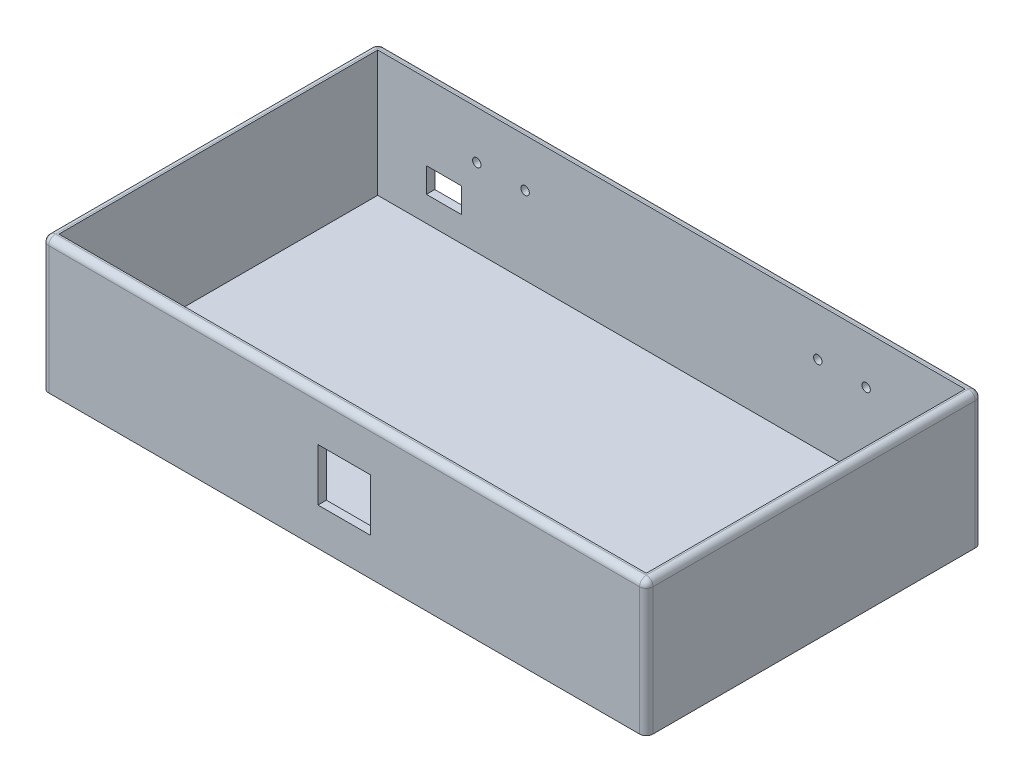
ISO-10303-21;
HEADER;
FILE_DESCRIPTION(('STEP AP214'),'2;1');
FILE_NAME('part.step','',(''),(''),'','','');
FILE_SCHEMA(('AUTOMOTIVE_DESIGN { 1 0 10303 214 1 1 1 1 }'));
ENDSEC;
DATA;
#1=APPLICATION_CONTEXT('core data for automotive mechanical design processes');
#2=APPLICATION_PROTOCOL_DEFINITION('international standard','automotive_design',2000,#1);
#3=PRODUCT_CONTEXT('',#1,'mechanical');
#4=PRODUCT('Part','Part','',(#3));
#5=PRODUCT_RELATED_PRODUCT_CATEGORY('part','',(#4));
#6=PRODUCT_DEFINITION_FORMATION('','',#4);
#7=PRODUCT_DEFINITION_CONTEXT('part definition',#1,'design');
#8=PRODUCT_DEFINITION('design','',#6,#7);
#9=PRODUCT_DEFINITION_SHAPE('','',#8);
#10=(LENGTH_UNIT() NAMED_UNIT(*) SI_UNIT(.MILLI.,.METRE.));
#11=(NAMED_UNIT(*) PLANE_ANGLE_UNIT() SI_UNIT($,.RADIAN.));
#12=(NAMED_UNIT(*) SI_UNIT($,.STERADIAN.) SOLID_ANGLE_UNIT());
#13=UNCERTAINTY_MEASURE_WITH_UNIT(LENGTH_MEASURE(1.E-05),#10,'distance_accuracy_value','');
#14=(GEOMETRIC_REPRESENTATION_CONTEXT(3) GLOBAL_UNCERTAINTY_ASSIGNED_CONTEXT((#13)) GLOBAL_UNIT_ASSIGNED_CONTEXT((#10,
#11,#12)) REPRESENTATION_CONTEXT('',''));
#15=CARTESIAN_POINT('',(0.,0.,0.));
#16=DIRECTION('',(0.,0.,1.));
#17=DIRECTION('',(1.,0.,0.));
#18=AXIS2_PLACEMENT_3D('',#15,#16,#17);
#19=CARTESIAN_POINT('',(228.6,101.6,-127.));
#20=DIRECTION('',(0.,0.,1.));
#21=DIRECTION('',(1.,0.,0.));
#22=AXIS2_PLACEMENT_3D('',#19,#20,#21);
#23=PLANE('',#22);
#24=DIRECTION('',(1.,0.,0.));
#25=VECTOR('',#24,1.);
#26=CARTESIAN_POINT('',(-185.42,44.196,-127.));
#27=LINE('',#26,#25);
#28=CARTESIAN_POINT('',(-185.42,44.196,-127.));
#29=VERTEX_POINT('',#28);
#30=CARTESIAN_POINT('',(-158.75,44.196,-127.));
#31=VERTEX_POINT('',#30);
#32=EDGE_CURVE('E206',#29,#31,#27,.T.);
#33=ORIENTED_EDGE('',*,*,#32,.F.);
#34=DIRECTION('',(0.,1.,0.));
#35=VECTOR('',#34,1.);
#36=CARTESIAN_POINT('',(-185.42,25.4,-127.));
#37=LINE('',#36,#35);
#38=CARTESIAN_POINT('',(-185.42,25.4,-127.));
#39=VERTEX_POINT('',#38);
#40=EDGE_CURVE('E54',#39,#29,#37,.T.);
#41=ORIENTED_EDGE('',*,*,#40,.F.);
#42=DIRECTION('',(1.,0.,0.));
#43=VECTOR('',#42,1.);
#44=CARTESIAN_POINT('',(-185.42,25.4,-127.));
#45=LINE('',#44,#43);
#46=CARTESIAN_POINT('',(-158.75,25.4,-127.));
#47=VERTEX_POINT('',#46);
#48=EDGE_CURVE('E193',#39,#47,#45,.T.);
#49=ORIENTED_EDGE('',*,*,#48,.T.);
#50=DIRECTION('',(0.,1.,0.));
#51=VECTOR('',#50,1.);
#52=CARTESIAN_POINT('',(-158.75,25.4,-127.));
#53=LINE('',#52,#51);
#54=EDGE_CURVE('E219',#47,#31,#53,.T.);
#55=ORIENTED_EDGE('',*,*,#54,.T.);
#56=EDGE_LOOP('',(#33,#41,#49,#55));
#57=FACE_BOUND('',#56,.T.);
#58=CARTESIAN_POINT('',(-110.744,65.278,-127.));
#59=DIRECTION('',(0.,0.,-1.));
#60=DIRECTION('',(-1.,0.,0.));
#61=AXIS2_PLACEMENT_3D('',#58,#59,#60);
#62=CIRCLE('',#61,3.17499999999998);
#63=CARTESIAN_POINT('',(-113.919,65.278,-127.));
#64=VERTEX_POINT('',#63);
#65=EDGE_CURVE('E232',#64,#64,#62,.T.);
#66=ORIENTED_EDGE('',*,*,#65,.F.);
#67=EDGE_LOOP('',(#66));
#68=FACE_BOUND('',#67,.T.);
#69=CARTESIAN_POINT('',(110.744,65.278,-127.));
#70=DIRECTION('',(0.,0.,1.));
#71=DIRECTION('',(1.,0.,0.));
#72=AXIS2_PLACEMENT_3D('',#69,#70,#71);
#73=CIRCLE('',#72,3.17499999999998);
#74=CARTESIAN_POINT('',(113.919,65.278,-127.));
#75=VERTEX_POINT('',#74);
#76=EDGE_CURVE('E236',#75,#75,#73,.T.);
#77=ORIENTED_EDGE('',*,*,#76,.T.);
#78=EDGE_LOOP('',(#77));
#79=FACE_BOUND('',#78,.T.);
#80=CARTESIAN_POINT('',(147.32,65.278,-127.));
#81=DIRECTION('',(0.,0.,1.));
#82=DIRECTION('',(1.,0.,0.));
#83=AXIS2_PLACEMENT_3D('',#80,#81,#82);
#84=CIRCLE('',#83,3.17499999999997);
#85=CARTESIAN_POINT('',(150.495,65.278,-127.));
#86=VERTEX_POINT('',#85);
#87=EDGE_CURVE('E217',#86,#86,#84,.T.);
#88=ORIENTED_EDGE('',*,*,#87,.T.);
#89=EDGE_LOOP('',(#88));
#90=FACE_BOUND('',#89,.T.);
#91=DIRECTION('',(-1.,0.,0.));
#92=VECTOR('',#91,1.);
#93=CARTESIAN_POINT('',(228.6,96.52,-127.));
#94=LINE('',#93,#92);
#95=CARTESIAN_POINT('',(-223.52,96.52,-127.));
#96=VERTEX_POINT('',#95);
#97=CARTESIAN_POINT('',(223.52,96.52,-127.));
#98=VERTEX_POINT('',#97);
#99=EDGE_CURVE('E338',#96,#98,#94,.F.);
#100=ORIENTED_EDGE('',*,*,#99,.T.);
#101=DIRECTION('',(0.,-1.,0.));
#102=VECTOR('',#101,1.);
#103=CARTESIAN_POINT('',(223.52,101.6,-127.));
#104=LINE('',#103,#102);
#105=CARTESIAN_POINT('',(223.52,0.,-127.));
#106=VERTEX_POINT('',#105);
#107=EDGE_CURVE('E340',#98,#106,#104,.T.);
#108=ORIENTED_EDGE('',*,*,#107,.T.);
#109=DIRECTION('',(-1.,0.,0.));
#110=VECTOR('',#109,1.);
#111=CARTESIAN_POINT('',(228.6,0.,-127.));
#112=LINE('',#111,#110);
#113=CARTESIAN_POINT('',(-223.52,0.,-127.));
#114=VERTEX_POINT('',#113);
#115=EDGE_CURVE('E317',#106,#114,#112,.T.);
#116=ORIENTED_EDGE('',*,*,#115,.T.);
#117=DIRECTION('',(0.,-1.,0.));
#118=VECTOR('',#117,1.);
#119=CARTESIAN_POINT('',(-223.52,101.6,-127.));
#120=LINE('',#119,#118);
#121=EDGE_CURVE('E336',#114,#96,#120,.F.);
#122=ORIENTED_EDGE('',*,*,#121,.T.);
#123=EDGE_LOOP('',(#100,#108,#116,#122));
#124=FACE_BOUND('',#123,.T.);
#125=CARTESIAN_POINT('',(-147.32,65.278,-127.));
#126=DIRECTION('',(0.,0.,-1.));
#127=DIRECTION('',(-1.,0.,0.));
#128=AXIS2_PLACEMENT_3D('',#125,#126,#127);
#129=CIRCLE('',#128,3.17499999999997);
#130=CARTESIAN_POINT('',(-150.495,65.278,-127.));
#131=VERTEX_POINT('',#130);
#132=EDGE_CURVE('E222',#131,#131,#129,.T.);
#133=ORIENTED_EDGE('',*,*,#132,.F.);
#134=EDGE_LOOP('',(#133));
#135=FACE_BOUND('',#134,.T.);
#136=ADVANCED_FACE('F37',(#57,#68,#79,#90,#124,#135),#23,.F.);
#137=CARTESIAN_POINT('',(228.6,101.6,-120.65));
#138=DIRECTION('',(0.,0.,1.));
#139=DIRECTION('',(1.,0.,0.));
#140=AXIS2_PLACEMENT_3D('',#137,#138,#139);
#141=PLANE('',#140);
#142=DIRECTION('',(0.,1.,0.));
#143=VECTOR('',#142,1.);
#144=CARTESIAN_POINT('',(-185.42,25.4,-120.65));
#145=LINE('',#144,#143);
#146=CARTESIAN_POINT('',(-185.42,25.4,-120.65));
#147=VERTEX_POINT('',#146);
#148=CARTESIAN_POINT('',(-185.42,44.196,-120.65));
#149=VERTEX_POINT('',#148);
#150=EDGE_CURVE('E190',#147,#149,#145,.T.);
#151=ORIENTED_EDGE('',*,*,#150,.T.);
#152=DIRECTION('',(1.,0.,0.));
#153=VECTOR('',#152,1.);
#154=CARTESIAN_POINT('',(-185.42,44.196,-120.65));
#155=LINE('',#154,#153);
#156=CARTESIAN_POINT('',(-158.75,44.196,-120.65));
#157=VERTEX_POINT('',#156);
#158=EDGE_CURVE('E210',#149,#157,#155,.T.);
#159=ORIENTED_EDGE('',*,*,#158,.T.);
#160=DIRECTION('',(0.,1.,0.));
#161=VECTOR('',#160,1.);
#162=CARTESIAN_POINT('',(-158.75,25.4,-120.65));
#163=LINE('',#162,#161);
#164=CARTESIAN_POINT('',(-158.75,25.4,-120.65));
#165=VERTEX_POINT('',#164);
#166=EDGE_CURVE('E216',#165,#157,#163,.T.);
#167=ORIENTED_EDGE('',*,*,#166,.F.);
#168=DIRECTION('',(1.,0.,0.));
#169=VECTOR('',#168,1.);
#170=CARTESIAN_POINT('',(-185.42,25.4,-120.65));
#171=LINE('',#170,#169);
#172=EDGE_CURVE('E208',#147,#165,#171,.T.);
#173=ORIENTED_EDGE('',*,*,#172,.F.);
#174=EDGE_LOOP('',(#151,#159,#167,#173));
#175=FACE_BOUND('',#174,.T.);
#176=CARTESIAN_POINT('',(110.744,65.278,-120.65));
#177=DIRECTION('',(0.,0.,1.));
#178=DIRECTION('',(1.,0.,0.));
#179=AXIS2_PLACEMENT_3D('',#176,#177,#178);
#180=CIRCLE('',#179,3.17499999999998);
#181=CARTESIAN_POINT('',(113.919,65.278,-120.65));
#182=VERTEX_POINT('',#181);
#183=EDGE_CURVE('E235',#182,#182,#180,.T.);
#184=ORIENTED_EDGE('',*,*,#183,.F.);
#185=EDGE_LOOP('',(#184));
#186=FACE_BOUND('',#185,.T.);
#187=CARTESIAN_POINT('',(147.32,65.278,-120.65));
#188=DIRECTION('',(0.,0.,1.));
#189=DIRECTION('',(1.,0.,0.));
#190=AXIS2_PLACEMENT_3D('',#187,#188,#189);
#191=CIRCLE('',#190,3.17499999999997);
#192=CARTESIAN_POINT('',(150.495,65.278,-120.65));
#193=VERTEX_POINT('',#192);
#194=EDGE_CURVE('E239',#193,#193,#191,.T.);
#195=ORIENTED_EDGE('',*,*,#194,.F.);
#196=EDGE_LOOP('',(#195));
#197=FACE_BOUND('',#196,.T.);
#198=DIRECTION('',(-1.,0.,0.));
#199=VECTOR('',#198,1.);
#200=CARTESIAN_POINT('',(228.6,6.34999999999999,-120.65));
#201=LINE('',#200,#199);
#202=CARTESIAN_POINT('',(222.25,6.35,-120.65));
#203=VERTEX_POINT('',#202);
#204=CARTESIAN_POINT('',(-222.25,6.35,-120.65));
#205=VERTEX_POINT('',#204);
#206=EDGE_CURVE('E297',#203,#205,#201,.T.);
#207=ORIENTED_EDGE('',*,*,#206,.F.);
#208=DIRECTION('',(0.,-1.,0.));
#209=VECTOR('',#208,1.);
#210=CARTESIAN_POINT('',(222.25,101.6,-120.65));
#211=LINE('',#210,#209);
#212=CARTESIAN_POINT('',(222.25,101.6,-120.65));
#213=VERTEX_POINT('',#212);
#214=EDGE_CURVE('E290',#213,#203,#211,.T.);
#215=ORIENTED_EDGE('',*,*,#214,.F.);
#216=DIRECTION('',(-1.,0.,0.));
#217=VECTOR('',#216,1.);
#218=CARTESIAN_POINT('',(228.6,101.6,-120.65));
#219=LINE('',#218,#217);
#220=CARTESIAN_POINT('',(-222.25,101.6,-120.65));
#221=VERTEX_POINT('',#220);
#222=EDGE_CURVE('E291',#213,#221,#219,.T.);
#223=ORIENTED_EDGE('',*,*,#222,.T.);
#224=DIRECTION('',(0.,-1.,0.));
#225=VECTOR('',#224,1.);
#226=CARTESIAN_POINT('',(-222.25,101.6,-120.65));
#227=LINE('',#226,#225);
#228=EDGE_CURVE('E287',#221,#205,#227,.T.);
#229=ORIENTED_EDGE('',*,*,#228,.T.);
#230=EDGE_LOOP('',(#207,#215,#223,#229));
#231=FACE_BOUND('',#230,.T.);
#232=CARTESIAN_POINT('',(-110.744,65.278,-120.65));
#233=DIRECTION('',(0.,0.,1.));
#234=DIRECTION('',(1.,0.,0.));
#235=AXIS2_PLACEMENT_3D('',#232,#233,#234);
#236=CIRCLE('',#235,3.17499999999998);
#237=CARTESIAN_POINT('',(-107.569,65.278,-120.65));
#238=VERTEX_POINT('',#237);
#239=EDGE_CURVE('E229',#238,#238,#236,.F.);
#240=ORIENTED_EDGE('',*,*,#239,.T.);
#241=EDGE_LOOP('',(#240));
#242=FACE_BOUND('',#241,.T.);
#243=CARTESIAN_POINT('',(-147.32,65.278,-120.65));
#244=DIRECTION('',(0.,0.,1.));
#245=DIRECTION('',(1.,0.,0.));
#246=AXIS2_PLACEMENT_3D('',#243,#244,#245);
#247=CIRCLE('',#246,3.17499999999997);
#248=CARTESIAN_POINT('',(-144.145,65.278,-120.65));
#249=VERTEX_POINT('',#248);
#250=EDGE_CURVE('E226',#249,#249,#247,.F.);
#251=ORIENTED_EDGE('',*,*,#250,.T.);
#252=EDGE_LOOP('',(#251));
#253=FACE_BOUND('',#252,.T.);
#254=ADVANCED_FACE('F466',(#175,#186,#197,#231,#242,#253),#141,.T.);
#255=CARTESIAN_POINT('',(-228.6,101.6,127.));
#256=DIRECTION('',(1.,0.,0.));
#257=DIRECTION('',(0.,0.,-1.));
#258=AXIS2_PLACEMENT_3D('',#255,#256,#257);
#259=PLANE('',#258);
#260=DIRECTION('',(0.,0.,1.));
#261=VECTOR('',#260,1.);
#262=CARTESIAN_POINT('',(-228.6,96.52,-127.));
#263=LINE('',#262,#261);
#264=CARTESIAN_POINT('',(-228.6,96.52,121.92));
#265=VERTEX_POINT('',#264);
#266=CARTESIAN_POINT('',(-228.6,96.52,-121.92));
#267=VERTEX_POINT('',#266);
#268=EDGE_CURVE('E344',#265,#267,#263,.F.);
#269=ORIENTED_EDGE('',*,*,#268,.T.);
#270=DIRECTION('',(0.,-1.,0.));
#271=VECTOR('',#270,1.);
#272=CARTESIAN_POINT('',(-228.6,101.6,-121.92));
#273=LINE('',#272,#271);
#274=CARTESIAN_POINT('',(-228.6,0.,-121.92));
#275=VERTEX_POINT('',#274);
#276=EDGE_CURVE('E346',#267,#275,#273,.T.);
#277=ORIENTED_EDGE('',*,*,#276,.T.);
#278=DIRECTION('',(0.,0.,1.));
#279=VECTOR('',#278,1.);
#280=CARTESIAN_POINT('',(-228.6,0.,127.));
#281=LINE('',#280,#279);
#282=CARTESIAN_POINT('',(-228.6,0.,121.92));
#283=VERTEX_POINT('',#282);
#284=EDGE_CURVE('E285',#275,#283,#281,.T.);
#285=ORIENTED_EDGE('',*,*,#284,.T.);
#286=DIRECTION('',(0.,-1.,0.));
#287=VECTOR('',#286,1.);
#288=CARTESIAN_POINT('',(-228.6,101.6,121.92));
#289=LINE('',#288,#287);
#290=EDGE_CURVE('E342',#283,#265,#289,.F.);
#291=ORIENTED_EDGE('',*,*,#290,.T.);
#292=EDGE_LOOP('',(#269,#277,#285,#291));
#293=FACE_BOUND('',#292,.T.);
#294=ADVANCED_FACE('F415',(#293),#259,.F.);
#295=CARTESIAN_POINT('',(228.6,101.6,127.));
#296=DIRECTION('',(0.,0.,-1.));
#297=DIRECTION('',(-1.,0.,0.));
#298=AXIS2_PLACEMENT_3D('',#295,#296,#297);
#299=PLANE('',#298);
#300=DIRECTION('',(-1.,0.,0.));
#301=VECTOR('',#300,1.);
#302=CARTESIAN_POINT('',(-19.812,68.072,127.));
#303=LINE('',#302,#301);
#304=CARTESIAN_POINT('',(19.812,68.072,127.));
#305=VERTEX_POINT('',#304);
#306=CARTESIAN_POINT('',(-19.812,68.072,127.));
#307=VERTEX_POINT('',#306);
#308=EDGE_CURVE('E258',#305,#307,#303,.T.);
#309=ORIENTED_EDGE('',*,*,#308,.F.);
#310=DIRECTION('',(0.,1.,0.));
#311=VECTOR('',#310,1.);
#312=CARTESIAN_POINT('',(19.812,28.448,127.));
#313=LINE('',#312,#311);
#314=CARTESIAN_POINT('',(19.812,28.448,127.));
#315=VERTEX_POINT('',#314);
#316=EDGE_CURVE('E261',#315,#305,#313,.T.);
#317=ORIENTED_EDGE('',*,*,#316,.F.);
#318=DIRECTION('',(1.,0.,0.));
#319=VECTOR('',#318,1.);
#320=CARTESIAN_POINT('',(-19.812,28.448,127.));
#321=LINE('',#320,#319);
#322=CARTESIAN_POINT('',(-19.812,28.448,127.));
#323=VERTEX_POINT('',#322);
#324=EDGE_CURVE('E251',#323,#315,#321,.T.);
#325=ORIENTED_EDGE('',*,*,#324,.F.);
#326=DIRECTION('',(0.,-1.,0.));
#327=VECTOR('',#326,1.);
#328=CARTESIAN_POINT('',(-19.812,28.448,127.));
#329=LINE('',#328,#327);
#330=EDGE_CURVE('E255',#307,#323,#329,.T.);
#331=ORIENTED_EDGE('',*,*,#330,.F.);
#332=EDGE_LOOP('',(#309,#317,#325,#331));
#333=FACE_BOUND('',#332,.T.);
#334=DIRECTION('',(1.,0.,0.));
#335=VECTOR('',#334,1.);
#336=CARTESIAN_POINT('',(228.6,0.,127.));
#337=LINE('',#336,#335);
#338=CARTESIAN_POINT('',(-223.52,0.,127.));
#339=VERTEX_POINT('',#338);
#340=CARTESIAN_POINT('',(223.52,0.,127.));
#341=VERTEX_POINT('',#340);
#342=EDGE_CURVE('E311',#339,#341,#337,.T.);
#343=ORIENTED_EDGE('',*,*,#342,.T.);
#344=DIRECTION('',(0.,-1.,0.));
#345=VECTOR('',#344,1.);
#346=CARTESIAN_POINT('',(223.52,101.6,127.));
#347=LINE('',#346,#345);
#348=CARTESIAN_POINT('',(223.52,96.52,127.));
#349=VERTEX_POINT('',#348);
#350=EDGE_CURVE('E352',#341,#349,#347,.F.);
#351=ORIENTED_EDGE('',*,*,#350,.T.);
#352=DIRECTION('',(1.,0.,0.));
#353=VECTOR('',#352,1.);
#354=CARTESIAN_POINT('',(-228.6,96.52,127.));
#355=LINE('',#354,#353);
#356=CARTESIAN_POINT('',(-223.52,96.52,127.));
#357=VERTEX_POINT('',#356);
#358=EDGE_CURVE('E350',#349,#357,#355,.F.);
#359=ORIENTED_EDGE('',*,*,#358,.T.);
#360=DIRECTION('',(0.,-1.,0.));
#361=VECTOR('',#360,1.);
#362=CARTESIAN_POINT('',(-223.52,101.6,127.));
#363=LINE('',#362,#361);
#364=EDGE_CURVE('E348',#357,#339,#363,.T.);
#365=ORIENTED_EDGE('',*,*,#364,.T.);
#366=EDGE_LOOP('',(#343,#351,#359,#365));
#367=FACE_BOUND('',#366,.T.);
#368=ADVANCED_FACE('F454',(#333,#367),#299,.F.);
#369=CARTESIAN_POINT('',(228.6,101.6,127.));
#370=DIRECTION('',(-1.,0.,0.));
#371=DIRECTION('',(0.,0.,1.));
#372=AXIS2_PLACEMENT_3D('',#369,#370,#371);
#373=PLANE('',#372);
#374=DIRECTION('',(0.,0.,-1.));
#375=VECTOR('',#374,1.);
#376=CARTESIAN_POINT('',(228.6,0.,127.));
#377=LINE('',#376,#375);
#378=CARTESIAN_POINT('',(228.6,0.,121.92));
#379=VERTEX_POINT('',#378);
#380=CARTESIAN_POINT('',(228.6,0.,-121.92));
#381=VERTEX_POINT('',#380);
#382=EDGE_CURVE('E314',#379,#381,#377,.T.);
#383=ORIENTED_EDGE('',*,*,#382,.T.);
#384=DIRECTION('',(0.,-1.,0.));
#385=VECTOR('',#384,1.);
#386=CARTESIAN_POINT('',(228.6,101.6,-121.92));
#387=LINE('',#386,#385);
#388=CARTESIAN_POINT('',(228.6,96.52,-121.92));
#389=VERTEX_POINT('',#388);
#390=EDGE_CURVE('E334',#381,#389,#387,.F.);
#391=ORIENTED_EDGE('',*,*,#390,.T.);
#392=DIRECTION('',(0.,0.,-1.));
#393=VECTOR('',#392,1.);
#394=CARTESIAN_POINT('',(228.6,96.52,127.));
#395=LINE('',#394,#393);
#396=CARTESIAN_POINT('',(228.6,96.52,121.92));
#397=VERTEX_POINT('',#396);
#398=EDGE_CURVE('E331',#389,#397,#395,.F.);
#399=ORIENTED_EDGE('',*,*,#398,.T.);
#400=DIRECTION('',(0.,-1.,0.));
#401=VECTOR('',#400,1.);
#402=CARTESIAN_POINT('',(228.6,101.6,121.92));
#403=LINE('',#402,#401);
#404=EDGE_CURVE('E329',#397,#379,#403,.T.);
#405=ORIENTED_EDGE('',*,*,#404,.T.);
#406=EDGE_LOOP('',(#383,#391,#399,#405));
#407=FACE_BOUND('',#406,.T.);
#408=ADVANCED_FACE('F445',(#407),#373,.F.);
#409=CARTESIAN_POINT('',(0.,101.6,0.));
#410=DIRECTION('',(0.,1.,0.));
#411=DIRECTION('',(0.,0.,1.));
#412=AXIS2_PLACEMENT_3D('',#409,#410,#411);
#413=PLANE('',#412);
#414=DIRECTION('',(1.,0.,0.));
#415=VECTOR('',#414,1.);
#416=CARTESIAN_POINT('',(228.6,101.6,121.92));
#417=LINE('',#416,#415);
#418=CARTESIAN_POINT('',(-223.52,101.6,121.92));
#419=VERTEX_POINT('',#418);
#420=CARTESIAN_POINT('',(223.52,101.6,121.92));
#421=VERTEX_POINT('',#420);
#422=EDGE_CURVE('E320',#419,#421,#417,.T.);
#423=ORIENTED_EDGE('',*,*,#422,.T.);
#424=DIRECTION('',(0.,0.,-1.));
#425=VECTOR('',#424,1.);
#426=CARTESIAN_POINT('',(223.52,101.6,-127.));
#427=LINE('',#426,#425);
#428=CARTESIAN_POINT('',(223.52,101.6,-121.92));
#429=VERTEX_POINT('',#428);
#430=EDGE_CURVE('E326',#421,#429,#427,.T.);
#431=ORIENTED_EDGE('',*,*,#430,.T.);
#432=DIRECTION('',(-1.,0.,0.));
#433=VECTOR('',#432,1.);
#434=CARTESIAN_POINT('',(-228.6,101.6,-121.92));
#435=LINE('',#434,#433);
#436=CARTESIAN_POINT('',(-223.52,101.6,-121.92));
#437=VERTEX_POINT('',#436);
#438=EDGE_CURVE('E324',#429,#437,#435,.T.);
#439=ORIENTED_EDGE('',*,*,#438,.T.);
#440=DIRECTION('',(0.,0.,1.));
#441=VECTOR('',#440,1.);
#442=CARTESIAN_POINT('',(-223.52,101.6,127.));
#443=LINE('',#442,#441);
#444=EDGE_CURVE('E322',#437,#419,#443,.T.);
#445=ORIENTED_EDGE('',*,*,#444,.T.);
#446=EDGE_LOOP('',(#423,#431,#439,#445));
#447=FACE_BOUND('',#446,.T.);
#448=DIRECTION('',(0.,0.,1.));
#449=VECTOR('',#448,1.);
#450=CARTESIAN_POINT('',(-222.25,101.6,127.));
#451=LINE('',#450,#449);
#452=CARTESIAN_POINT('',(-222.25,101.6,120.65));
#453=VERTEX_POINT('',#452);
#454=EDGE_CURVE('E301',#221,#453,#451,.T.);
#455=ORIENTED_EDGE('',*,*,#454,.F.);
#456=ORIENTED_EDGE('',*,*,#222,.F.);
#457=DIRECTION('',(0.,0.,-1.));
#458=VECTOR('',#457,1.);
#459=CARTESIAN_POINT('',(222.25,101.6,127.));
#460=LINE('',#459,#458);
#461=CARTESIAN_POINT('',(222.25,101.6,120.65));
#462=VERTEX_POINT('',#461);
#463=EDGE_CURVE('E305',#462,#213,#460,.T.);
#464=ORIENTED_EDGE('',*,*,#463,.F.);
#465=DIRECTION('',(1.,0.,0.));
#466=VECTOR('',#465,1.);
#467=CARTESIAN_POINT('',(228.6,101.6,120.65));
#468=LINE('',#467,#466);
#469=EDGE_CURVE('E303',#453,#462,#468,.T.);
#470=ORIENTED_EDGE('',*,*,#469,.F.);
#471=EDGE_LOOP('',(#455,#456,#464,#470));
#472=FACE_BOUND('',#471,.T.);
#473=ADVANCED_FACE('F404',(#447,#472),#413,.T.);
#474=CARTESIAN_POINT('',(0.,0.,0.));
#475=DIRECTION('',(0.,1.,0.));
#476=DIRECTION('',(0.,0.,1.));
#477=AXIS2_PLACEMENT_3D('',#474,#475,#476);
#478=PLANE('',#477);
#479=ORIENTED_EDGE('',*,*,#115,.F.);
#480=CARTESIAN_POINT('',(223.52,0.,-121.92));
#481=DIRECTION('',(0.,1.,0.));
#482=DIRECTION('',(0.,0.,1.));
#483=AXIS2_PLACEMENT_3D('',#480,#481,#482);
#484=CIRCLE('',#483,5.08);
#485=EDGE_CURVE('E11',#106,#381,#484,.F.);
#486=ORIENTED_EDGE('',*,*,#485,.T.);
#487=ORIENTED_EDGE('',*,*,#382,.F.);
#488=CARTESIAN_POINT('',(223.52,0.,121.92));
#489=DIRECTION('',(0.,1.,0.));
#490=DIRECTION('',(0.,0.,1.));
#491=AXIS2_PLACEMENT_3D('',#488,#489,#490);
#492=CIRCLE('',#491,5.08);
#493=EDGE_CURVE('E46',#379,#341,#492,.F.);
#494=ORIENTED_EDGE('',*,*,#493,.T.);
#495=ORIENTED_EDGE('',*,*,#342,.F.);
#496=CARTESIAN_POINT('',(-223.52,0.,121.92));
#497=DIRECTION('',(0.,1.,0.));
#498=DIRECTION('',(0.,0.,1.));
#499=AXIS2_PLACEMENT_3D('',#496,#497,#498);
#500=CIRCLE('',#499,5.08);
#501=EDGE_CURVE('E354',#339,#283,#500,.F.);
#502=ORIENTED_EDGE('',*,*,#501,.T.);
#503=ORIENTED_EDGE('',*,*,#284,.F.);
#504=CARTESIAN_POINT('',(-223.52,0.,-121.92));
#505=DIRECTION('',(0.,1.,0.));
#506=DIRECTION('',(0.,0.,1.));
#507=AXIS2_PLACEMENT_3D('',#504,#505,#506);
#508=CIRCLE('',#507,5.08);
#509=EDGE_CURVE('E356',#275,#114,#508,.F.);
#510=ORIENTED_EDGE('',*,*,#509,.T.);
#511=EDGE_LOOP('',(#479,#486,#487,#494,#495,#502,#503,#510));
#512=FACE_BOUND('',#511,.T.);
#513=ADVANCED_FACE('F425',(#512),#478,.F.);
#514=CARTESIAN_POINT('',(-222.25,101.6,127.));
#515=DIRECTION('',(1.,0.,0.));
#516=DIRECTION('',(0.,0.,-1.));
#517=AXIS2_PLACEMENT_3D('',#514,#515,#516);
#518=PLANE('',#517);
#519=DIRECTION('',(0.,0.,1.));
#520=VECTOR('',#519,1.);
#521=CARTESIAN_POINT('',(-222.25,6.34999999999999,127.));
#522=LINE('',#521,#520);
#523=CARTESIAN_POINT('',(-222.25,6.35,120.65));
#524=VERTEX_POINT('',#523);
#525=EDGE_CURVE('E278',#205,#524,#522,.T.);
#526=ORIENTED_EDGE('',*,*,#525,.F.);
#527=ORIENTED_EDGE('',*,*,#228,.F.);
#528=ORIENTED_EDGE('',*,*,#454,.T.);
#529=DIRECTION('',(0.,-1.,0.));
#530=VECTOR('',#529,1.);
#531=CARTESIAN_POINT('',(-222.25,101.6,120.65));
#532=LINE('',#531,#530);
#533=EDGE_CURVE('E282',#453,#524,#532,.T.);
#534=ORIENTED_EDGE('',*,*,#533,.T.);
#535=EDGE_LOOP('',(#526,#527,#528,#534));
#536=FACE_BOUND('',#535,.T.);
#537=ADVANCED_FACE('F667',(#536),#518,.T.);
#538=CARTESIAN_POINT('',(228.6,101.6,120.65));
#539=DIRECTION('',(0.,0.,-1.));
#540=DIRECTION('',(-1.,0.,0.));
#541=AXIS2_PLACEMENT_3D('',#538,#539,#540);
#542=PLANE('',#541);
#543=DIRECTION('',(0.,1.,0.));
#544=VECTOR('',#543,1.);
#545=CARTESIAN_POINT('',(19.812,28.448,120.65));
#546=LINE('',#545,#544);
#547=CARTESIAN_POINT('',(19.812,28.448,120.65));
#548=VERTEX_POINT('',#547);
#549=CARTESIAN_POINT('',(19.812,68.072,120.65));
#550=VERTEX_POINT('',#549);
#551=EDGE_CURVE('E225',#548,#550,#546,.T.);
#552=ORIENTED_EDGE('',*,*,#551,.T.);
#553=DIRECTION('',(-1.,0.,0.));
#554=VECTOR('',#553,1.);
#555=CARTESIAN_POINT('',(-19.8119999999999,68.072,120.65));
#556=LINE('',#555,#554);
#557=CARTESIAN_POINT('',(-19.812,68.072,120.65));
#558=VERTEX_POINT('',#557);
#559=EDGE_CURVE('E246',#550,#558,#556,.T.);
#560=ORIENTED_EDGE('',*,*,#559,.T.);
#561=DIRECTION('',(0.,-1.,0.));
#562=VECTOR('',#561,1.);
#563=CARTESIAN_POINT('',(-19.812,28.448,120.65));
#564=LINE('',#563,#562);
#565=CARTESIAN_POINT('',(-19.812,28.448,120.65));
#566=VERTEX_POINT('',#565);
#567=EDGE_CURVE('E270',#558,#566,#564,.T.);
#568=ORIENTED_EDGE('',*,*,#567,.T.);
#569=DIRECTION('',(1.,0.,0.));
#570=VECTOR('',#569,1.);
#571=CARTESIAN_POINT('',(-19.8119999999999,28.448,120.65));
#572=LINE('',#571,#570);
#573=EDGE_CURVE('E266',#566,#548,#572,.T.);
#574=ORIENTED_EDGE('',*,*,#573,.T.);
#575=EDGE_LOOP('',(#552,#560,#568,#574));
#576=FACE_BOUND('',#575,.T.);
#577=DIRECTION('',(1.,0.,0.));
#578=VECTOR('',#577,1.);
#579=CARTESIAN_POINT('',(228.6,6.34999999999999,120.65));
#580=LINE('',#579,#578);
#581=CARTESIAN_POINT('',(222.25,6.35,120.65));
#582=VERTEX_POINT('',#581);
#583=EDGE_CURVE('E281',#524,#582,#580,.T.);
#584=ORIENTED_EDGE('',*,*,#583,.F.);
#585=ORIENTED_EDGE('',*,*,#533,.F.);
#586=ORIENTED_EDGE('',*,*,#469,.T.);
#587=DIRECTION('',(0.,-1.,0.));
#588=VECTOR('',#587,1.);
#589=CARTESIAN_POINT('',(222.25,101.6,120.65));
#590=LINE('',#589,#588);
#591=EDGE_CURVE('E286',#462,#582,#590,.T.);
#592=ORIENTED_EDGE('',*,*,#591,.T.);
#593=EDGE_LOOP('',(#584,#585,#586,#592));
#594=FACE_BOUND('',#593,.T.);
#595=ADVANCED_FACE('F670',(#576,#594),#542,.T.);
#596=CARTESIAN_POINT('',(222.25,101.6,127.));
#597=DIRECTION('',(-1.,0.,0.));
#598=DIRECTION('',(0.,0.,1.));
#599=AXIS2_PLACEMENT_3D('',#596,#597,#598);
#600=PLANE('',#599);
#601=DIRECTION('',(0.,0.,-1.));
#602=VECTOR('',#601,1.);
#603=CARTESIAN_POINT('',(222.25,6.34999999999999,127.));
#604=LINE('',#603,#602);
#605=EDGE_CURVE('E293',#582,#203,#604,.T.);
#606=ORIENTED_EDGE('',*,*,#605,.F.);
#607=ORIENTED_EDGE('',*,*,#591,.F.);
#608=ORIENTED_EDGE('',*,*,#463,.T.);
#609=ORIENTED_EDGE('',*,*,#214,.T.);
#610=EDGE_LOOP('',(#606,#607,#608,#609));
#611=FACE_BOUND('',#610,.T.);
#612=ADVANCED_FACE('F462',(#611),#600,.T.);
#613=CARTESIAN_POINT('',(0.,6.35,0.));
#614=DIRECTION('',(0.,1.,0.));
#615=DIRECTION('',(0.,0.,1.));
#616=AXIS2_PLACEMENT_3D('',#613,#614,#615);
#617=PLANE('',#616);
#618=ORIENTED_EDGE('',*,*,#525,.T.);
#619=ORIENTED_EDGE('',*,*,#583,.T.);
#620=ORIENTED_EDGE('',*,*,#605,.T.);
#621=ORIENTED_EDGE('',*,*,#206,.T.);
#622=EDGE_LOOP('',(#618,#619,#620,#621));
#623=FACE_BOUND('',#622,.T.);
#624=ADVANCED_FACE('F457',(#623),#617,.T.);
#625=CARTESIAN_POINT('',(-223.52,101.6,121.92));
#626=DIRECTION('',(0.,-1.,0.));
#627=DIRECTION('',(0.,0.,-1.));
#628=AXIS2_PLACEMENT_3D('',#625,#626,#627);
#629=CYLINDRICAL_SURFACE('',#628,5.08);
#630=ORIENTED_EDGE('',*,*,#501,.F.);
#631=ORIENTED_EDGE('',*,*,#364,.F.);
#632=CARTESIAN_POINT('',(-223.52,96.52,121.92));
#633=DIRECTION('',(0.,1.,0.));
#634=DIRECTION('',(0.,0.,1.));
#635=AXIS2_PLACEMENT_3D('',#632,#633,#634);
#636=CIRCLE('',#635,5.08);
#637=EDGE_CURVE('E41',#265,#357,#636,.T.);
#638=ORIENTED_EDGE('',*,*,#637,.F.);
#639=ORIENTED_EDGE('',*,*,#290,.F.);
#640=EDGE_LOOP('',(#630,#631,#638,#639));
#641=FACE_BOUND('',#640,.T.);
#642=ADVANCED_FACE('F39',(#641),#629,.T.);
#643=CARTESIAN_POINT('',(-223.52,96.52,0.));
#644=DIRECTION('',(0.,0.,-1.));
#645=DIRECTION('',(-1.,0.,0.));
#646=AXIS2_PLACEMENT_3D('',#643,#644,#645);
#647=CYLINDRICAL_SURFACE('',#646,5.08);
#648=CARTESIAN_POINT('',(-223.52,96.52,-121.92));
#649=DIRECTION('',(0.,0.,-1.));
#650=DIRECTION('',(-1.,0.,0.));
#651=AXIS2_PLACEMENT_3D('',#648,#649,#650);
#652=CIRCLE('',#651,5.08);
#653=EDGE_CURVE('E383',#267,#437,#652,.T.);
#654=ORIENTED_EDGE('',*,*,#653,.F.);
#655=ORIENTED_EDGE('',*,*,#268,.F.);
#656=CARTESIAN_POINT('',(-223.52,96.52,121.92));
#657=DIRECTION('',(0.,0.,1.));
#658=DIRECTION('',(1.,0.,0.));
#659=AXIS2_PLACEMENT_3D('',#656,#657,#658);
#660=CIRCLE('',#659,5.08);
#661=EDGE_CURVE('E385',#419,#265,#660,.T.);
#662=ORIENTED_EDGE('',*,*,#661,.F.);
#663=ORIENTED_EDGE('',*,*,#444,.F.);
#664=EDGE_LOOP('',(#654,#655,#662,#663));
#665=FACE_BOUND('',#664,.T.);
#666=ADVANCED_FACE('F412',(#665),#647,.T.);
#667=CARTESIAN_POINT('',(-223.52,101.6,-121.92));
#668=DIRECTION('',(0.,-1.,0.));
#669=DIRECTION('',(0.,0.,-1.));
#670=AXIS2_PLACEMENT_3D('',#667,#668,#669);
#671=CYLINDRICAL_SURFACE('',#670,5.08);
#672=ORIENTED_EDGE('',*,*,#509,.F.);
#673=ORIENTED_EDGE('',*,*,#276,.F.);
#674=CARTESIAN_POINT('',(-223.52,96.52,-121.92));
#675=DIRECTION('',(0.,1.,0.));
#676=DIRECTION('',(0.,0.,1.));
#677=AXIS2_PLACEMENT_3D('',#674,#675,#676);
#678=CIRCLE('',#677,5.08);
#679=EDGE_CURVE('E380',#96,#267,#678,.T.);
#680=ORIENTED_EDGE('',*,*,#679,.F.);
#681=ORIENTED_EDGE('',*,*,#121,.F.);
#682=EDGE_LOOP('',(#672,#673,#680,#681));
#683=FACE_BOUND('',#682,.T.);
#684=ADVANCED_FACE('F420',(#683),#671,.T.);
#685=CARTESIAN_POINT('',(-223.52,96.52,121.92));
#686=DIRECTION('',(0.,0.,1.));
#687=DIRECTION('',(1.,0.,0.));
#688=AXIS2_PLACEMENT_3D('',#685,#686,#687);
#689=SPHERICAL_SURFACE('',#688,5.08);
#690=ORIENTED_EDGE('',*,*,#661,.T.);
#691=ORIENTED_EDGE('',*,*,#637,.T.);
#692=CARTESIAN_POINT('',(-223.52,96.52,121.92));
#693=DIRECTION('',(-1.,0.,0.));
#694=DIRECTION('',(0.,-1.,0.));
#695=AXIS2_PLACEMENT_3D('',#692,#693,#694);
#696=CIRCLE('',#695,5.08);
#697=EDGE_CURVE('E377',#419,#357,#696,.F.);
#698=ORIENTED_EDGE('',*,*,#697,.F.);
#699=EDGE_LOOP('',(#690,#691,#698));
#700=FACE_BOUND('',#699,.T.);
#701=ADVANCED_FACE('F392',(#700),#689,.T.);
#702=CARTESIAN_POINT('',(-223.52,96.52,-121.92));
#703=DIRECTION('',(0.,0.,1.));
#704=DIRECTION('',(1.,0.,0.));
#705=AXIS2_PLACEMENT_3D('',#702,#703,#704);
#706=SPHERICAL_SURFACE('',#705,5.08);
#707=ORIENTED_EDGE('',*,*,#679,.T.);
#708=ORIENTED_EDGE('',*,*,#653,.T.);
#709=CARTESIAN_POINT('',(-223.52,96.52,-121.92));
#710=DIRECTION('',(-1.,0.,0.));
#711=DIRECTION('',(0.,0.,1.));
#712=AXIS2_PLACEMENT_3D('',#709,#710,#711);
#713=CIRCLE('',#712,5.08);
#714=EDGE_CURVE('E374',#96,#437,#713,.F.);
#715=ORIENTED_EDGE('',*,*,#714,.F.);
#716=EDGE_LOOP('',(#707,#708,#715));
#717=FACE_BOUND('',#716,.T.);
#718=ADVANCED_FACE('F501',(#717),#706,.T.);
#719=CARTESIAN_POINT('',(223.52,101.6,121.92));
#720=DIRECTION('',(0.,-1.,0.));
#721=DIRECTION('',(0.,0.,-1.));
#722=AXIS2_PLACEMENT_3D('',#719,#720,#721);
#723=CYLINDRICAL_SURFACE('',#722,5.08);
#724=ORIENTED_EDGE('',*,*,#493,.F.);
#725=ORIENTED_EDGE('',*,*,#404,.F.);
#726=CARTESIAN_POINT('',(223.52,96.52,121.92));
#727=DIRECTION('',(0.,1.,0.));
#728=DIRECTION('',(0.,0.,1.));
#729=AXIS2_PLACEMENT_3D('',#726,#727,#728);
#730=CIRCLE('',#729,5.08);
#731=EDGE_CURVE('E371',#349,#397,#730,.T.);
#732=ORIENTED_EDGE('',*,*,#731,.F.);
#733=ORIENTED_EDGE('',*,*,#350,.F.);
#734=EDGE_LOOP('',(#724,#725,#732,#733));
#735=FACE_BOUND('',#734,.T.);
#736=ADVANCED_FACE('F452',(#735),#723,.T.);
#737=CARTESIAN_POINT('',(0.,96.52,121.92));
#738=DIRECTION('',(-1.,0.,0.));
#739=DIRECTION('',(0.,0.,1.));
#740=AXIS2_PLACEMENT_3D('',#737,#738,#739);
#741=CYLINDRICAL_SURFACE('',#740,5.08);
#742=ORIENTED_EDGE('',*,*,#697,.T.);
#743=ORIENTED_EDGE('',*,*,#358,.F.);
#744=CARTESIAN_POINT('',(223.52,96.52,121.92));
#745=DIRECTION('',(1.,0.,0.));
#746=DIRECTION('',(0.,0.,-1.));
#747=AXIS2_PLACEMENT_3D('',#744,#745,#746);
#748=CIRCLE('',#747,5.08);
#749=EDGE_CURVE('E368',#421,#349,#748,.T.);
#750=ORIENTED_EDGE('',*,*,#749,.F.);
#751=ORIENTED_EDGE('',*,*,#422,.F.);
#752=EDGE_LOOP('',(#742,#743,#750,#751));
#753=FACE_BOUND('',#752,.T.);
#754=ADVANCED_FACE('F399',(#753),#741,.T.);
#755=CARTESIAN_POINT('',(0.,96.52,-121.92));
#756=DIRECTION('',(1.,0.,0.));
#757=DIRECTION('',(0.,0.,-1.));
#758=AXIS2_PLACEMENT_3D('',#755,#756,#757);
#759=CYLINDRICAL_SURFACE('',#758,5.08);
#760=ORIENTED_EDGE('',*,*,#714,.T.);
#761=ORIENTED_EDGE('',*,*,#438,.F.);
#762=CARTESIAN_POINT('',(223.52,96.52,-121.92));
#763=DIRECTION('',(1.,0.,0.));
#764=DIRECTION('',(0.,0.,-1.));
#765=AXIS2_PLACEMENT_3D('',#762,#763,#764);
#766=CIRCLE('',#765,5.08);
#767=EDGE_CURVE('E365',#98,#429,#766,.T.);
#768=ORIENTED_EDGE('',*,*,#767,.F.);
#769=ORIENTED_EDGE('',*,*,#99,.F.);
#770=EDGE_LOOP('',(#760,#761,#768,#769));
#771=FACE_BOUND('',#770,.T.);
#772=ADVANCED_FACE('F438',(#771),#759,.T.);
#773=CARTESIAN_POINT('',(223.52,101.6,-121.92));
#774=DIRECTION('',(0.,-1.,0.));
#775=DIRECTION('',(0.,0.,-1.));
#776=AXIS2_PLACEMENT_3D('',#773,#774,#775);
#777=CYLINDRICAL_SURFACE('',#776,5.08);
#778=ORIENTED_EDGE('',*,*,#485,.F.);
#779=ORIENTED_EDGE('',*,*,#107,.F.);
#780=CARTESIAN_POINT('',(223.52,96.52,-121.92));
#781=DIRECTION('',(0.,1.,0.));
#782=DIRECTION('',(0.,0.,1.));
#783=AXIS2_PLACEMENT_3D('',#780,#781,#782);
#784=CIRCLE('',#783,5.08);
#785=EDGE_CURVE('E362',#389,#98,#784,.T.);
#786=ORIENTED_EDGE('',*,*,#785,.F.);
#787=ORIENTED_EDGE('',*,*,#390,.F.);
#788=EDGE_LOOP('',(#778,#779,#786,#787));
#789=FACE_BOUND('',#788,.T.);
#790=ADVANCED_FACE('F434',(#789),#777,.T.);
#791=CARTESIAN_POINT('',(223.52,96.52,121.92));
#792=DIRECTION('',(0.,0.,1.));
#793=DIRECTION('',(1.,0.,0.));
#794=AXIS2_PLACEMENT_3D('',#791,#792,#793);
#795=SPHERICAL_SURFACE('',#794,5.08);
#796=ORIENTED_EDGE('',*,*,#749,.T.);
#797=ORIENTED_EDGE('',*,*,#731,.T.);
#798=CARTESIAN_POINT('',(223.52,96.52,121.92));
#799=DIRECTION('',(0.,0.,1.));
#800=DIRECTION('',(1.,0.,0.));
#801=AXIS2_PLACEMENT_3D('',#798,#799,#800);
#802=CIRCLE('',#801,5.08);
#803=EDGE_CURVE('E360',#421,#397,#802,.F.);
#804=ORIENTED_EDGE('',*,*,#803,.F.);
#805=EDGE_LOOP('',(#796,#797,#804));
#806=FACE_BOUND('',#805,.T.);
#807=ADVANCED_FACE('F489',(#806),#795,.T.);
#808=CARTESIAN_POINT('',(223.52,96.52,-121.92));
#809=DIRECTION('',(0.,0.,1.));
#810=DIRECTION('',(1.,0.,0.));
#811=AXIS2_PLACEMENT_3D('',#808,#809,#810);
#812=SPHERICAL_SURFACE('',#811,5.08);
#813=ORIENTED_EDGE('',*,*,#785,.T.);
#814=ORIENTED_EDGE('',*,*,#767,.T.);
#815=CARTESIAN_POINT('',(223.52,96.52,-121.92));
#816=DIRECTION('',(0.,0.,-1.));
#817=DIRECTION('',(-1.,0.,0.));
#818=AXIS2_PLACEMENT_3D('',#815,#816,#817);
#819=CIRCLE('',#818,5.08);
#820=EDGE_CURVE('E254',#389,#429,#819,.F.);
#821=ORIENTED_EDGE('',*,*,#820,.F.);
#822=EDGE_LOOP('',(#813,#814,#821));
#823=FACE_BOUND('',#822,.T.);
#824=ADVANCED_FACE('F441',(#823),#812,.T.);
#825=CARTESIAN_POINT('',(223.52,96.52,0.));
#826=DIRECTION('',(0.,0.,1.));
#827=DIRECTION('',(1.,0.,0.));
#828=AXIS2_PLACEMENT_3D('',#825,#826,#827);
#829=CYLINDRICAL_SURFACE('',#828,5.08);
#830=ORIENTED_EDGE('',*,*,#803,.T.);
#831=ORIENTED_EDGE('',*,*,#398,.F.);
#832=ORIENTED_EDGE('',*,*,#820,.T.);
#833=ORIENTED_EDGE('',*,*,#430,.F.);
#834=EDGE_LOOP('',(#830,#831,#832,#833));
#835=FACE_BOUND('',#834,.T.);
#836=ADVANCED_FACE('F443',(#835),#829,.T.);
#837=CARTESIAN_POINT('',(19.812,28.448,-127.001));
#838=DIRECTION('',(1.,0.,0.));
#839=DIRECTION('',(0.,0.,-1.));
#840=AXIS2_PLACEMENT_3D('',#837,#838,#839);
#841=PLANE('',#840);
#842=DIRECTION('',(0.,0.,1.));
#843=VECTOR('',#842,1.);
#844=CARTESIAN_POINT('',(19.812,28.448,-127.001));
#845=LINE('',#844,#843);
#846=EDGE_CURVE('E269',#548,#315,#845,.T.);
#847=ORIENTED_EDGE('',*,*,#846,.T.);
#848=ORIENTED_EDGE('',*,*,#316,.T.);
#849=DIRECTION('',(0.,0.,1.));
#850=VECTOR('',#849,1.);
#851=CARTESIAN_POINT('',(19.812,68.072,-127.001));
#852=LINE('',#851,#850);
#853=EDGE_CURVE('E265',#550,#305,#852,.T.);
#854=ORIENTED_EDGE('',*,*,#853,.F.);
#855=ORIENTED_EDGE('',*,*,#551,.F.);
#856=EDGE_LOOP('',(#847,#848,#854,#855));
#857=FACE_BOUND('',#856,.T.);
#858=ADVANCED_FACE('F486',(#857),#841,.F.);
#859=CARTESIAN_POINT('',(-19.812,28.448,-127.001));
#860=DIRECTION('',(0.,-1.,0.));
#861=DIRECTION('',(0.,0.,-1.));
#862=AXIS2_PLACEMENT_3D('',#859,#860,#861);
#863=PLANE('',#862);
#864=DIRECTION('',(0.,0.,1.));
#865=VECTOR('',#864,1.);
#866=CARTESIAN_POINT('',(-19.812,28.448,-127.001));
#867=LINE('',#866,#865);
#868=EDGE_CURVE('E250',#566,#323,#867,.T.);
#869=ORIENTED_EDGE('',*,*,#868,.T.);
#870=ORIENTED_EDGE('',*,*,#324,.T.);
#871=ORIENTED_EDGE('',*,*,#846,.F.);
#872=ORIENTED_EDGE('',*,*,#573,.F.);
#873=EDGE_LOOP('',(#869,#870,#871,#872));
#874=FACE_BOUND('',#873,.T.);
#875=ADVANCED_FACE('F567',(#874),#863,.F.);
#876=CARTESIAN_POINT('',(-19.812,28.448,-127.001));
#877=DIRECTION('',(-1.,0.,0.));
#878=DIRECTION('',(0.,0.,1.));
#879=AXIS2_PLACEMENT_3D('',#876,#877,#878);
#880=PLANE('',#879);
#881=DIRECTION('',(0.,0.,1.));
#882=VECTOR('',#881,1.);
#883=CARTESIAN_POINT('',(-19.812,68.072,-127.001));
#884=LINE('',#883,#882);
#885=EDGE_CURVE('E249',#558,#307,#884,.T.);
#886=ORIENTED_EDGE('',*,*,#885,.T.);
#887=ORIENTED_EDGE('',*,*,#330,.T.);
#888=ORIENTED_EDGE('',*,*,#868,.F.);
#889=ORIENTED_EDGE('',*,*,#567,.F.);
#890=EDGE_LOOP('',(#886,#887,#888,#889));
#891=FACE_BOUND('',#890,.T.);
#892=ADVANCED_FACE('F576',(#891),#880,.F.);
#893=CARTESIAN_POINT('',(-19.812,68.072,-127.001));
#894=DIRECTION('',(0.,1.,0.));
#895=DIRECTION('',(0.,0.,1.));
#896=AXIS2_PLACEMENT_3D('',#893,#894,#895);
#897=PLANE('',#896);
#898=ORIENTED_EDGE('',*,*,#853,.T.);
#899=ORIENTED_EDGE('',*,*,#308,.T.);
#900=ORIENTED_EDGE('',*,*,#885,.F.);
#901=ORIENTED_EDGE('',*,*,#559,.F.);
#902=EDGE_LOOP('',(#898,#899,#900,#901));
#903=FACE_BOUND('',#902,.T.);
#904=ADVANCED_FACE('F584',(#903),#897,.F.);
#905=CARTESIAN_POINT('',(147.32,65.278,127.001));
#906=DIRECTION('',(0.,0.,-1.));
#907=DIRECTION('',(-1.,0.,0.));
#908=AXIS2_PLACEMENT_3D('',#905,#906,#907);
#909=CYLINDRICAL_SURFACE('',#908,3.17499999999997);
#910=ORIENTED_EDGE('',*,*,#194,.T.);
#911=EDGE_LOOP('',(#910));
#912=FACE_BOUND('',#911,.T.);
#913=ORIENTED_EDGE('',*,*,#87,.F.);
#914=EDGE_LOOP('',(#913));
#915=FACE_BOUND('',#914,.T.);
#916=ADVANCED_FACE('F592',(#912,#915),#909,.F.);
#917=CARTESIAN_POINT('',(110.744,65.278,127.001));
#918=DIRECTION('',(0.,0.,-1.));
#919=DIRECTION('',(-1.,0.,0.));
#920=AXIS2_PLACEMENT_3D('',#917,#918,#919);
#921=CYLINDRICAL_SURFACE('',#920,3.17499999999998);
#922=ORIENTED_EDGE('',*,*,#183,.T.);
#923=EDGE_LOOP('',(#922));
#924=FACE_BOUND('',#923,.T.);
#925=ORIENTED_EDGE('',*,*,#76,.F.);
#926=EDGE_LOOP('',(#925));
#927=FACE_BOUND('',#926,.T.);
#928=ADVANCED_FACE('F599',(#924,#927),#921,.F.);
#929=CARTESIAN_POINT('',(-110.744,65.278,127.001));
#930=DIRECTION('',(0.,0.,-1.));
#931=DIRECTION('',(-1.,0.,0.));
#932=AXIS2_PLACEMENT_3D('',#929,#930,#931);
#933=CYLINDRICAL_SURFACE('',#932,3.17499999999998);
#934=ORIENTED_EDGE('',*,*,#239,.F.);
#935=EDGE_LOOP('',(#934));
#936=FACE_BOUND('',#935,.T.);
#937=ORIENTED_EDGE('',*,*,#65,.T.);
#938=EDGE_LOOP('',(#937));
#939=FACE_BOUND('',#938,.T.);
#940=ADVANCED_FACE('F606',(#936,#939),#933,.F.);
#941=CARTESIAN_POINT('',(-147.32,65.278,127.001));
#942=DIRECTION('',(0.,0.,-1.));
#943=DIRECTION('',(-1.,0.,0.));
#944=AXIS2_PLACEMENT_3D('',#941,#942,#943);
#945=CYLINDRICAL_SURFACE('',#944,3.17499999999997);
#946=ORIENTED_EDGE('',*,*,#250,.F.);
#947=EDGE_LOOP('',(#946));
#948=FACE_BOUND('',#947,.T.);
#949=ORIENTED_EDGE('',*,*,#132,.T.);
#950=EDGE_LOOP('',(#949));
#951=FACE_BOUND('',#950,.T.);
#952=ADVANCED_FACE('F614',(#948,#951),#945,.F.);
#953=CARTESIAN_POINT('',(-185.42,25.4,127.001));
#954=DIRECTION('',(-1.,0.,0.));
#955=DIRECTION('',(0.,0.,1.));
#956=AXIS2_PLACEMENT_3D('',#953,#954,#955);
#957=PLANE('',#956);
#958=DIRECTION('',(0.,0.,-1.));
#959=VECTOR('',#958,1.);
#960=CARTESIAN_POINT('',(-185.42,25.4,127.001));
#961=LINE('',#960,#959);
#962=EDGE_CURVE('E186',#147,#39,#961,.T.);
#963=ORIENTED_EDGE('',*,*,#962,.T.);
#964=ORIENTED_EDGE('',*,*,#40,.T.);
#965=DIRECTION('',(0.,0.,-1.));
#966=VECTOR('',#965,1.);
#967=CARTESIAN_POINT('',(-185.42,44.196,127.001));
#968=LINE('',#967,#966);
#969=EDGE_CURVE('E194',#149,#29,#968,.T.);
#970=ORIENTED_EDGE('',*,*,#969,.F.);
#971=ORIENTED_EDGE('',*,*,#150,.F.);
#972=EDGE_LOOP('',(#963,#964,#970,#971));
#973=FACE_BOUND('',#972,.T.);
#974=ADVANCED_FACE('F188',(#973),#957,.F.);
#975=CARTESIAN_POINT('',(-185.42,25.4,127.001));
#976=DIRECTION('',(0.,1.,0.));
#977=DIRECTION('',(-1.,0.,0.));
#978=AXIS2_PLACEMENT_3D('',#975,#976,#977);
#979=PLANE('',#978);
#980=ORIENTED_EDGE('',*,*,#172,.T.);
#981=DIRECTION('',(0.,0.,-1.));
#982=VECTOR('',#981,1.);
#983=CARTESIAN_POINT('',(-158.75,25.4,127.001));
#984=LINE('',#983,#982);
#985=EDGE_CURVE('E199',#165,#47,#984,.T.);
#986=ORIENTED_EDGE('',*,*,#985,.T.);
#987=ORIENTED_EDGE('',*,*,#48,.F.);
#988=ORIENTED_EDGE('',*,*,#962,.F.);
#989=EDGE_LOOP('',(#980,#986,#987,#988));
#990=FACE_BOUND('',#989,.T.);
#991=ADVANCED_FACE('F197',(#990),#979,.T.);
#992=CARTESIAN_POINT('',(-158.75,25.4,127.001));
#993=DIRECTION('',(-1.,0.,0.));
#994=DIRECTION('',(0.,0.,1.));
#995=AXIS2_PLACEMENT_3D('',#992,#993,#994);
#996=PLANE('',#995);
#997=ORIENTED_EDGE('',*,*,#166,.T.);
#998=DIRECTION('',(0.,0.,-1.));
#999=VECTOR('',#998,1.);
#1000=CARTESIAN_POINT('',(-158.75,44.196,127.001));
#1001=LINE('',#1000,#999);
#1002=EDGE_CURVE('E62',#157,#31,#1001,.T.);
#1003=ORIENTED_EDGE('',*,*,#1002,.T.);
#1004=ORIENTED_EDGE('',*,*,#54,.F.);
#1005=ORIENTED_EDGE('',*,*,#985,.F.);
#1006=EDGE_LOOP('',(#997,#1003,#1004,#1005));
#1007=FACE_BOUND('',#1006,.T.);
#1008=ADVANCED_FACE('F633',(#1007),#996,.T.);
#1009=CARTESIAN_POINT('',(-185.42,44.196,127.001));
#1010=DIRECTION('',(0.,1.,0.));
#1011=DIRECTION('',(-1.,0.,0.));
#1012=AXIS2_PLACEMENT_3D('',#1009,#1010,#1011);
#1013=PLANE('',#1012);
#1014=ORIENTED_EDGE('',*,*,#969,.T.);
#1015=ORIENTED_EDGE('',*,*,#32,.T.);
#1016=ORIENTED_EDGE('',*,*,#1002,.F.);
#1017=ORIENTED_EDGE('',*,*,#158,.F.);
#1018=EDGE_LOOP('',(#1014,#1015,#1016,#1017));
#1019=FACE_BOUND('',#1018,.T.);
#1020=ADVANCED_FACE('F640',(#1019),#1013,.F.);
#1021=CLOSED_SHELL('',(#136,#254,#294,#368,#408,#473,#513,#537,#595,#612,#624,#642,#666,#684,
#701,#718,#736,#754,#772,#790,#807,#824,#836,#858,#875,#892,#904,#916,#928,#940,#952,#974,#991,
#1008,#1020));
#1022=MANIFOLD_SOLID_BREP('B2',#1021);
#1023=ADVANCED_BREP_SHAPE_REPRESENTATION('',(#18,#1022),#14);
#1024=SHAPE_DEFINITION_REPRESENTATION(#9,#1023);
ENDSEC;
END-ISO-10303-21;
